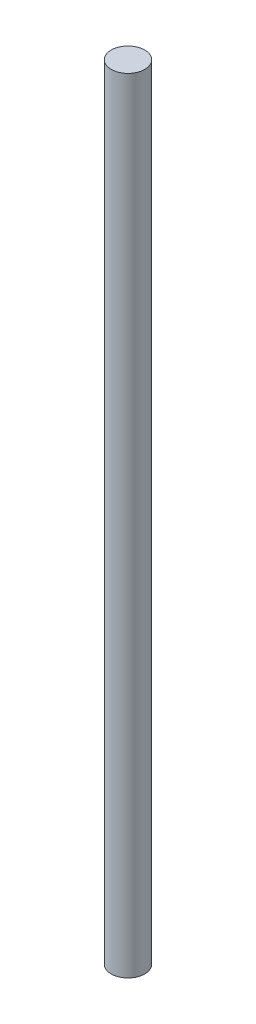
ISO-10303-21;
HEADER;
FILE_DESCRIPTION(('STEP AP214'),'2;1');
FILE_NAME('part.step','',(''),(''),'','','');
FILE_SCHEMA(('AUTOMOTIVE_DESIGN { 1 0 10303 214 1 1 1 1 }'));
ENDSEC;
DATA;
#1=APPLICATION_CONTEXT('core data for automotive mechanical design processes');
#2=APPLICATION_PROTOCOL_DEFINITION('international standard','automotive_design',2000,#1);
#3=PRODUCT_CONTEXT('',#1,'mechanical');
#4=PRODUCT('Part','Part','',(#3));
#5=PRODUCT_RELATED_PRODUCT_CATEGORY('part','',(#4));
#6=PRODUCT_DEFINITION_FORMATION('','',#4);
#7=PRODUCT_DEFINITION_CONTEXT('part definition',#1,'design');
#8=PRODUCT_DEFINITION('design','',#6,#7);
#9=PRODUCT_DEFINITION_SHAPE('','',#8);
#10=(LENGTH_UNIT() NAMED_UNIT(*) SI_UNIT(.MILLI.,.METRE.));
#11=(NAMED_UNIT(*) PLANE_ANGLE_UNIT() SI_UNIT($,.RADIAN.));
#12=(NAMED_UNIT(*) SI_UNIT($,.STERADIAN.) SOLID_ANGLE_UNIT());
#13=UNCERTAINTY_MEASURE_WITH_UNIT(LENGTH_MEASURE(1.E-05),#10,'distance_accuracy_value','');
#14=(GEOMETRIC_REPRESENTATION_CONTEXT(3) GLOBAL_UNCERTAINTY_ASSIGNED_CONTEXT((#13)) GLOBAL_UNIT_ASSIGNED_CONTEXT((#10,
#11,#12)) REPRESENTATION_CONTEXT('',''));
#15=CARTESIAN_POINT('',(0.,0.,0.));
#16=DIRECTION('',(0.,0.,1.));
#17=DIRECTION('',(1.,0.,0.));
#18=AXIS2_PLACEMENT_3D('',#15,#16,#17);
#19=CARTESIAN_POINT('',(0.,700.,0.));
#20=DIRECTION('',(0.,-1.,0.));
#21=DIRECTION('',(0.,0.,-1.));
#22=AXIS2_PLACEMENT_3D('',#19,#20,#21);
#23=CYLINDRICAL_SURFACE('',#22,15.);
#24=CARTESIAN_POINT('',(0.,700.,0.));
#25=DIRECTION('',(0.,1.,0.));
#26=DIRECTION('',(0.,0.,1.));
#27=AXIS2_PLACEMENT_3D('',#24,#25,#26);
#28=CIRCLE('',#27,15.);
#29=CARTESIAN_POINT('',(0.,700.,15.));
#30=VERTEX_POINT('',#29);
#31=EDGE_CURVE('E10',#30,#30,#28,.T.);
#32=ORIENTED_EDGE('',*,*,#31,.F.);
#33=EDGE_LOOP('',(#32));
#34=FACE_BOUND('',#33,.T.);
#35=CARTESIAN_POINT('',(0.,0.,0.));
#36=DIRECTION('',(0.,1.,0.));
#37=DIRECTION('',(0.,0.,1.));
#38=AXIS2_PLACEMENT_3D('',#35,#36,#37);
#39=CIRCLE('',#38,15.);
#40=CARTESIAN_POINT('',(0.,0.,15.));
#41=VERTEX_POINT('',#40);
#42=EDGE_CURVE('E42',#41,#41,#39,.T.);
#43=ORIENTED_EDGE('',*,*,#42,.T.);
#44=EDGE_LOOP('',(#43));
#45=FACE_BOUND('',#44,.T.);
#46=ADVANCED_FACE('F39',(#34,#45),#23,.T.);
#47=CARTESIAN_POINT('',(0.,700.,0.));
#48=DIRECTION('',(0.,1.,0.));
#49=DIRECTION('',(0.,0.,1.));
#50=AXIS2_PLACEMENT_3D('',#47,#48,#49);
#51=PLANE('',#50);
#52=ORIENTED_EDGE('',*,*,#31,.T.);
#53=EDGE_LOOP('',(#52));
#54=FACE_BOUND('',#53,.T.);
#55=ADVANCED_FACE('F54',(#54),#51,.T.);
#56=CARTESIAN_POINT('',(0.,0.,0.));
#57=DIRECTION('',(0.,1.,0.));
#58=DIRECTION('',(0.,0.,1.));
#59=AXIS2_PLACEMENT_3D('',#56,#57,#58);
#60=PLANE('',#59);
#61=ORIENTED_EDGE('',*,*,#42,.F.);
#62=EDGE_LOOP('',(#61));
#63=FACE_BOUND('',#62,.T.);
#64=ADVANCED_FACE('F52',(#63),#60,.F.);
#65=CLOSED_SHELL('',(#46,#55,#64));
#66=MANIFOLD_SOLID_BREP('B2',#65);
#67=ADVANCED_BREP_SHAPE_REPRESENTATION('',(#18,#66),#14);
#68=SHAPE_DEFINITION_REPRESENTATION(#9,#67);
ENDSEC;
END-ISO-10303-21;
